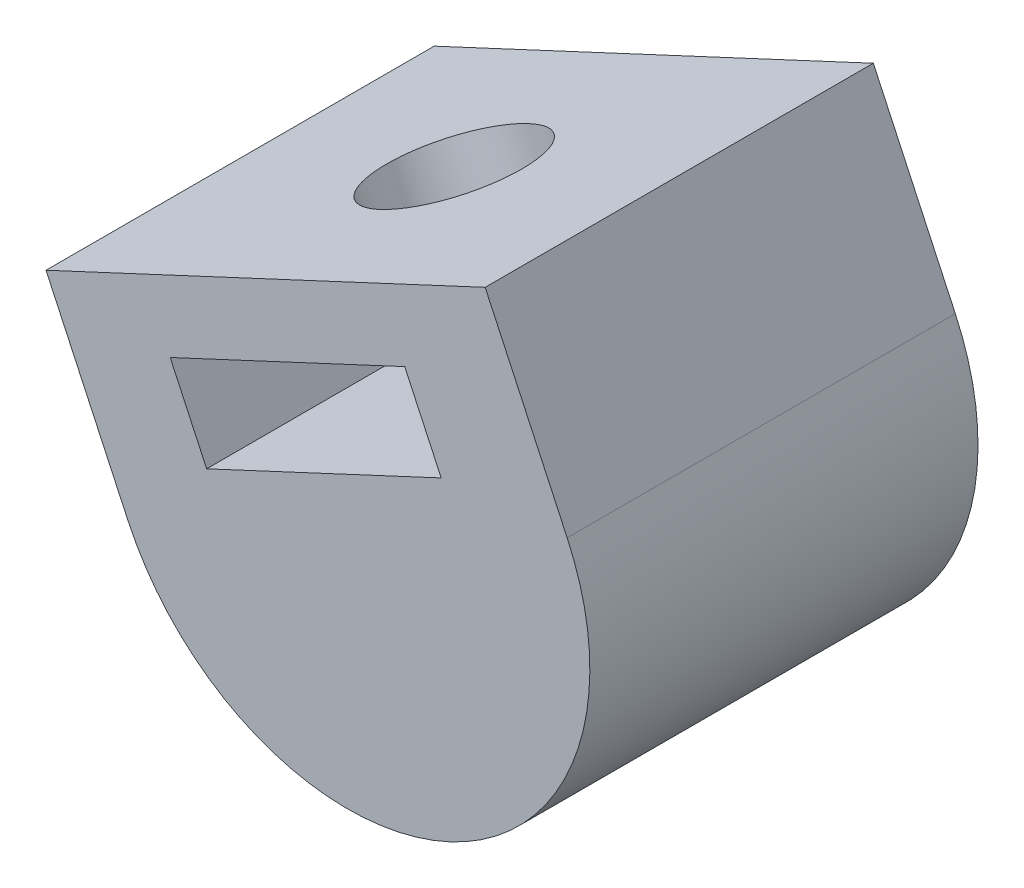
ISO-10303-21;
HEADER;
FILE_DESCRIPTION(('STEP AP214'),'2;1');
FILE_NAME('part.step','',(''),(''),'','','');
FILE_SCHEMA(('AUTOMOTIVE_DESIGN { 1 0 10303 214 1 1 1 1 }'));
ENDSEC;
DATA;
#1=APPLICATION_CONTEXT('core data for automotive mechanical design processes');
#2=APPLICATION_PROTOCOL_DEFINITION('international standard','automotive_design',2000,#1);
#3=PRODUCT_CONTEXT('',#1,'mechanical');
#4=PRODUCT('Part','Part','',(#3));
#5=PRODUCT_RELATED_PRODUCT_CATEGORY('part','',(#4));
#6=PRODUCT_DEFINITION_FORMATION('','',#4);
#7=PRODUCT_DEFINITION_CONTEXT('part definition',#1,'design');
#8=PRODUCT_DEFINITION('design','',#6,#7);
#9=PRODUCT_DEFINITION_SHAPE('','',#8);
#10=(LENGTH_UNIT() NAMED_UNIT(*) SI_UNIT(.MILLI.,.METRE.));
#11=(NAMED_UNIT(*) PLANE_ANGLE_UNIT() SI_UNIT($,.RADIAN.));
#12=(NAMED_UNIT(*) SI_UNIT($,.STERADIAN.) SOLID_ANGLE_UNIT());
#13=UNCERTAINTY_MEASURE_WITH_UNIT(LENGTH_MEASURE(1.E-05),#10,'distance_accuracy_value','');
#14=(GEOMETRIC_REPRESENTATION_CONTEXT(3) GLOBAL_UNCERTAINTY_ASSIGNED_CONTEXT((#13)) GLOBAL_UNIT_ASSIGNED_CONTEXT((#10,
#11,#12)) REPRESENTATION_CONTEXT('',''));
#15=CARTESIAN_POINT('',(0.,0.,0.));
#16=DIRECTION('',(0.,0.,1.));
#17=DIRECTION('',(1.,0.,0.));
#18=AXIS2_PLACEMENT_3D('',#15,#16,#17);
#19=CARTESIAN_POINT('',(-58.4915042211938,328.701917424214,705.274961638451));
#20=DIRECTION('',(-0.4226182617407,0.90630778703665,0.));
#21=DIRECTION('',(0.90630778703665,0.4226182617407,0.));
#22=AXIS2_PLACEMENT_3D('',#19,#20,#21);
#23=CYLINDRICAL_SURFACE('',#22,1.725);
#24=CARTESIAN_POINT('',(-53.208775949435,317.373070086256,705.274961638451));
#25=DIRECTION('',(0.422618261740699,-0.90630778703665,0.));
#26=DIRECTION('',(0.90630778703665,0.422618261740699,0.));
#27=AXIS2_PLACEMENT_3D('',#24,#25,#26);
#28=CIRCLE('',#27,1.725);
#29=CARTESIAN_POINT('',(-51.6453950167968,318.102086587759,705.274961638451));
#30=VERTEX_POINT('',#29);
#31=EDGE_CURVE('E118',#30,#30,#28,.T.);
#32=ORIENTED_EDGE('',*,*,#31,.F.);
#33=EDGE_LOOP('',(#32));
#34=FACE_BOUND('',#33,.T.);
#35=CARTESIAN_POINT('',(-52.574848556824,316.013608405701,705.274961638451));
#36=DIRECTION('',(-0.4226182617407,0.90630778703665,0.));
#37=DIRECTION('',(0.90630778703665,0.4226182617407,0.));
#38=AXIS2_PLACEMENT_3D('',#35,#36,#37);
#39=CIRCLE('',#38,1.725);
#40=CARTESIAN_POINT('',(-51.0114676241858,316.742624907204,705.274961638451));
#41=VERTEX_POINT('',#40);
#42=EDGE_CURVE('E168',#41,#41,#39,.T.);
#43=ORIENTED_EDGE('',*,*,#42,.F.);
#44=EDGE_LOOP('',(#43));
#45=FACE_BOUND('',#44,.T.);
#46=ADVANCED_FACE('F15',(#34,#45),#23,.F.);
#47=CARTESIAN_POINT('',(-58.4915042211938,328.701917424214,705.274961638451));
#48=DIRECTION('',(-0.4226182617407,0.90630778703665,0.));
#49=DIRECTION('',(0.90630778703665,0.4226182617407,0.));
#50=AXIS2_PLACEMENT_3D('',#47,#48,#49);
#51=CYLINDRICAL_SURFACE('',#50,1.725);
#52=CARTESIAN_POINT('',(-51.7296120333426,314.200992831628,705.274961638451));
#53=DIRECTION('',(0.4226182617407,-0.90630778703665,0.));
#54=DIRECTION('',(0.90630778703665,0.4226182617407,0.));
#55=AXIS2_PLACEMENT_3D('',#52,#53,#54);
#56=CIRCLE('',#55,1.725);
#57=CARTESIAN_POINT('',(-50.1662311007044,314.930009333131,705.274961638451));
#58=VERTEX_POINT('',#57);
#59=EDGE_CURVE('E10',#58,#58,#56,.T.);
#60=ORIENTED_EDGE('',*,*,#59,.F.);
#61=EDGE_LOOP('',(#60));
#62=FACE_BOUND('',#61,.T.);
#63=CARTESIAN_POINT('',(-47.4662810061886,309.139947670411,705.274962199146));
#64=CARTESIAN_POINT('',(-47.4662815410024,309.139946568465,705.369832388337));
#65=CARTESIAN_POINT('',(-47.4724130890117,309.134518511518,705.464711682187));
#66=CARTESIAN_POINT('',(-47.4968126855066,309.113200644251,705.651703281042));
#67=CARTESIAN_POINT('',(-47.5150841830552,309.097307860826,705.743814791921));
#68=CARTESIAN_POINT('',(-47.5633716388458,309.056199591341,705.9225511289));
#69=CARTESIAN_POINT('',(-47.5933700093457,309.030998069456,706.009183946835));
#70=CARTESIAN_POINT('',(-47.6646027934089,308.972866248474,706.17490341727));
#71=CARTESIAN_POINT('',(-47.705838866681,308.939934807836,706.253988952773));
#72=CARTESIAN_POINT('',(-47.8001219368036,308.867298409225,706.404607150837));
#73=CARTESIAN_POINT('',(-47.8534451602928,308.827441163681,706.475893562954));
#74=CARTESIAN_POINT('',(-47.9704288036865,308.743739089574,706.606685487549));
#75=CARTESIAN_POINT('',(-48.0340901813065,308.699893891737,706.666189907422));
#76=CARTESIAN_POINT('',(-48.1716773234788,308.60975968082,706.772564850328));
#77=CARTESIAN_POINT('',(-48.2457420178201,308.563443972135,706.819233704374));
#78=CARTESIAN_POINT('',(-48.4018017080488,308.47126597415,706.897245679985));
#79=CARTESIAN_POINT('',(-48.4837948008438,308.425403578938,706.928592468495));
#80=CARTESIAN_POINT('',(-48.6509780584652,308.337597947447,706.974158781225));
#81=CARTESIAN_POINT('',(-48.7359918599348,308.295577493181,706.988876293972));
#82=CARTESIAN_POINT('',(-48.9090938558653,308.215517444955,707.002401286348));
#83=CARTESIAN_POINT('',(-48.9971814911041,308.177477131871,707.001211645067));
#84=CARTESIAN_POINT('',(-49.1712931431152,308.107485546846,706.983292117599));
#85=CARTESIAN_POINT('',(-49.2573061655355,308.075394000211,706.966996735808));
#86=CARTESIAN_POINT('',(-49.427220751448,308.016546423408,706.920094762925));
#87=CARTESIAN_POINT('',(-49.5111221136763,307.98979090015,706.889486813094));
#88=CARTESIAN_POINT('',(-49.6759312162397,307.941224124186,706.81424964698));
#89=CARTESIAN_POINT('',(-49.7567543575809,307.919513985467,706.769370453741));
#90=CARTESIAN_POINT('',(-49.9113977379439,307.881330746246,706.667061727911));
#91=CARTESIAN_POINT('',(-49.9852160583263,307.864859077687,706.60962877096));
#92=CARTESIAN_POINT('',(-50.1266613414979,307.835915441796,706.480921439785));
#93=CARTESIAN_POINT('',(-50.1938855214718,307.823645945534,706.409158032466));
#94=CARTESIAN_POINT('',(-50.3160481711363,307.803236396622,706.255304462243));
#95=CARTESIAN_POINT('',(-50.3709854590363,307.795096741097,706.173213307171));
#96=CARTESIAN_POINT('',(-50.4667220841544,307.781990015005,706.000205741894));
#97=CARTESIAN_POINT('',(-50.5074283405168,307.777043659157,705.909236030408));
#98=CARTESIAN_POINT('',(-50.5722854231581,307.769595676079,705.721486182407));
#99=CARTESIAN_POINT('',(-50.5964432386562,307.767093016565,705.624708517681));
#100=CARTESIAN_POINT('',(-50.6262158673529,307.764062463126,705.432986348161));
#101=CARTESIAN_POINT('',(-50.6326510061677,307.76344705171,705.338170436926));
#102=CARTESIAN_POINT('',(-50.6290076501959,307.763805075535,705.148869498186));
#103=CARTESIAN_POINT('',(-50.6189318595029,307.764778250605,705.054384419039));
#104=CARTESIAN_POINT('',(-50.5833646291182,307.768469881417,704.871493988389));
#105=CARTESIAN_POINT('',(-50.5583648161911,307.771132841358,704.78299091546));
#106=CARTESIAN_POINT('',(-50.4944895576784,307.778622683216,704.611247135083));
#107=CARTESIAN_POINT('',(-50.4556117224934,307.78344993783,704.528007336804));
#108=CARTESIAN_POINT('',(-50.3640390702933,307.796122857899,704.366176052029));
#109=CARTESIAN_POINT('',(-50.310937851797,307.804061143129,704.287822147214));
#110=CARTESIAN_POINT('',(-50.1934616087111,307.823747127438,704.140609602092));
#111=CARTESIAN_POINT('',(-50.129083353779,307.83549591887,704.071753692646));
#112=CARTESIAN_POINT('',(-49.9877786461993,307.864261195231,703.942096092325));
#113=CARTESIAN_POINT('',(-49.9103999531131,307.881502327685,703.881835644409));
#114=CARTESIAN_POINT('',(-49.7479789372193,307.921760043341,703.775135562457));
#115=CARTESIAN_POINT('',(-49.6629366617326,307.944776590884,703.728695843089));
#116=CARTESIAN_POINT('',(-49.4881456598929,307.996898229024,703.651219988901));
#117=CARTESIAN_POINT('',(-49.3984116162441,308.025985088102,703.620138647473));
#118=CARTESIAN_POINT('',(-49.2169423514731,308.09016494702,703.574340522409));
#119=CARTESIAN_POINT('',(-49.1252077845148,308.125256008461,703.559618468791));
#120=CARTESIAN_POINT('',(-48.9466671759879,308.199086146244,703.547428832895));
#121=CARTESIAN_POINT('',(-48.8598181504771,308.237605002372,703.549250199138));
#122=CARTESIAN_POINT('',(-48.6896073278886,308.318280887788,703.568443911326));
#123=CARTESIAN_POINT('',(-48.6062451899058,308.360437560175,703.585814733298));
#124=CARTESIAN_POINT('',(-48.4467214660518,308.445988285816,703.635071159205));
#125=CARTESIAN_POINT('',(-48.3704563624884,308.489345801154,703.666686547334));
#126=CARTESIAN_POINT('',(-48.2251372871655,308.576238693135,703.743369210743));
#127=CARTESIAN_POINT('',(-48.1560843415494,308.619774094176,703.788438396714));
#128=CARTESIAN_POINT('',(-48.0246596236783,308.706316581774,703.892212502126));
#129=CARTESIAN_POINT('',(-47.9625299910687,308.749274482256,703.951264865894));
#130=CARTESIAN_POINT('',(-47.8482774353496,308.831269245151,704.080708975486));
#131=CARTESIAN_POINT('',(-47.796157281688,308.870305020959,704.151103849706));
#132=CARTESIAN_POINT('',(-47.7012360625873,308.94353343109,704.30388656805));
#133=CARTESIAN_POINT('',(-47.6587836413034,308.977532816031,704.386584359186));
#134=CARTESIAN_POINT('',(-47.5861018894124,309.037028548994,704.56000680196));
#135=CARTESIAN_POINT('',(-47.5558679590629,309.062528096209,704.650728417262));
#136=CARTESIAN_POINT('',(-47.5102347619426,309.101511441701,704.829560444934));
#137=CARTESIAN_POINT('',(-47.4937780240755,309.115844196652,704.917217255977));
#138=CARTESIAN_POINT('',(-47.471801941202,309.135061927956,705.094901016265));
#139=CARTESIAN_POINT('',(-47.4662804986341,309.13994871619,705.18492750761));
#140=CARTESIAN_POINT('',(-47.4662810061886,309.139947670411,705.274962199146));
#141=B_SPLINE_CURVE_WITH_KNOTS('',3,(#63,#64,#65,#66,#67,#68,#69,#70,#71,#72,#73,#74,#75,#76,
#77,#78,#79,#80,#81,#82,#83,#84,#85,#86,#87,#88,#89,#90,#91,#92,#93,#94,#95,#96,#97,#98,#99,
#100,#101,#102,#103,#104,#105,#106,#107,#108,#109,#110,#111,#112,#113,#114,#115,#116,#117,#118,
#119,#120,#121,#122,#123,#124,#125,#126,#127,#128,#129,#130,#131,#132,#133,#134,#135,#136,#137,
#138,#139,#140),.UNSPECIFIED.,.T.,.F.,(4,2,2,2,2,2,2,2,2,2,2,2,2,2,2,2,2,2,2,2,2,2,2,2,2,2,2,2,
2,2,2,2,2,2,2,2,2,2,4),(0.,0.284280031897781,0.568640864727391,0.85257684475264,
1.13655478234896,1.42782866502052,1.71912954639972,2.01477512440425,2.31034991248505,
2.59681699788449,2.88323223534569,3.16165638613407,3.44010697398648,3.72373178304281,
4.00743405481161,4.30333698041896,4.59926835464024,4.89710062296492,5.19480702441089,
5.47848153208782,5.76210958533864,6.03687341178668,6.31168457152043,6.59538851426581,
6.87917385819079,7.17650332232316,7.47383095063508,7.77027811803814,8.06662976023287,
8.35030628717471,8.6339550145791,8.91243585102633,9.19095625581117,9.47729975520451,
9.76372236706075,10.0592439480939,10.3546541739507,10.6244963251381,10.8942867113473),.UNSPECIFIED.);
#142=CARTESIAN_POINT('',(-47.4662810061886,309.139947670411,705.274962199146));
#143=VERTEX_POINT('',#142);
#144=EDGE_CURVE('E19',#143,#143,#141,.F.);
#145=ORIENTED_EDGE('',*,*,#144,.F.);
#146=EDGE_LOOP('',(#145));
#147=FACE_BOUND('',#146,.T.);
#148=ADVANCED_FACE('F191',(#62,#147),#51,.F.);
#149=CARTESIAN_POINT('',(-51.7296120333426,314.200992831628,703.274961638451));
#150=DIRECTION('',(0.4226182617407,-0.90630778703665,0.));
#151=DIRECTION('',(0.90630778703665,0.4226182617407,0.));
#152=AXIS2_PLACEMENT_3D('',#149,#150,#151);
#153=PLANE('',#152);
#154=ORIENTED_EDGE('',*,*,#59,.T.);
#155=EDGE_LOOP('',(#154));
#156=FACE_BOUND('',#155,.T.);
#157=DIRECTION('',(0.90630778703665,0.4226182617407,0.));
#158=VECTOR('',#157,1.);
#159=CARTESIAN_POINT('',(-51.4488500361707,314.331914301028,700.774898862839));
#160=LINE('',#159,#158);
#161=CARTESIAN_POINT('',(-54.4485353944526,312.933138046406,700.774898862839));
#162=VERTEX_POINT('',#161);
#163=CARTESIAN_POINT('',(-49.0106886722327,315.46884761685,700.774898862839));
#164=VERTEX_POINT('',#163);
#165=EDGE_CURVE('E38',#162,#164,#160,.T.);
#166=ORIENTED_EDGE('',*,*,#165,.F.);
#167=DIRECTION('',(0.,0.,-1.));
#168=VECTOR('',#167,1.);
#169=CARTESIAN_POINT('',(-54.4485353944526,312.933138046406,703.274961638451));
#170=LINE('',#169,#168);
#171=CARTESIAN_POINT('',(-54.4485353944526,312.933138046406,709.774948120117));
#172=VERTEX_POINT('',#171);
#173=EDGE_CURVE('E156',#172,#162,#170,.T.);
#174=ORIENTED_EDGE('',*,*,#173,.F.);
#175=DIRECTION('',(-0.90630778703665,-0.4226182617407,0.));
#176=VECTOR('',#175,1.);
#177=CARTESIAN_POINT('',(-51.4488500361707,314.331914301028,709.774948120117));
#178=LINE('',#177,#176);
#179=CARTESIAN_POINT('',(-49.0106886722327,315.46884761685,709.774948120117));
#180=VERTEX_POINT('',#179);
#181=EDGE_CURVE('E161',#180,#172,#178,.T.);
#182=ORIENTED_EDGE('',*,*,#181,.F.);
#183=DIRECTION('',(0.,0.,1.));
#184=VECTOR('',#183,1.);
#185=CARTESIAN_POINT('',(-49.0106886722327,315.46884761685,703.274961638451));
#186=LINE('',#185,#184);
#187=EDGE_CURVE('E29',#164,#180,#186,.T.);
#188=ORIENTED_EDGE('',*,*,#187,.F.);
#189=EDGE_LOOP('',(#166,#174,#182,#188));
#190=FACE_BOUND('',#189,.T.);
#191=ADVANCED_FACE('F198',(#156,#190),#153,.F.);
#192=CARTESIAN_POINT('',(-50.2785434574548,318.18777097796,703.274961638451));
#193=DIRECTION('',(-0.90630778703665,-0.4226182617407,0.));
#194=DIRECTION('',(0.4226182617407,-0.90630778703665,0.));
#195=AXIS2_PLACEMENT_3D('',#192,#193,#194);
#196=PLANE('',#195);
#197=DIRECTION('',(-0.4226182617407,0.90630778703665,0.));
#198=VECTOR('',#197,1.);
#199=CARTESIAN_POINT('',(-50.4898525883252,318.640924871478,700.774898862839));
#200=LINE('',#199,#198);
#201=CARTESIAN_POINT('',(-49.8559251957142,317.281463190923,700.774898862839));
#202=VERTEX_POINT('',#201);
#203=EDGE_CURVE('E152',#164,#202,#200,.T.);
#204=ORIENTED_EDGE('',*,*,#203,.F.);
#205=ORIENTED_EDGE('',*,*,#187,.T.);
#206=DIRECTION('',(0.4226182617407,-0.90630778703665,0.));
#207=VECTOR('',#206,1.);
#208=CARTESIAN_POINT('',(-50.4898525883252,318.640924871478,709.774948120117));
#209=LINE('',#208,#207);
#210=CARTESIAN_POINT('',(-49.8559251957142,317.281463190923,709.774948120117));
#211=VERTEX_POINT('',#210);
#212=EDGE_CURVE('E171',#211,#180,#209,.T.);
#213=ORIENTED_EDGE('',*,*,#212,.F.);
#214=DIRECTION('',(0.,0.,-1.));
#215=VECTOR('',#214,1.);
#216=CARTESIAN_POINT('',(-49.8559251957142,317.281463190923,703.274961638451));
#217=LINE('',#216,#215);
#218=EDGE_CURVE('E173',#211,#202,#217,.T.);
#219=ORIENTED_EDGE('',*,*,#218,.T.);
#220=EDGE_LOOP('',(#204,#205,#213,#219));
#221=FACE_BOUND('',#220,.T.);
#222=ADVANCED_FACE('F205',(#221),#196,.T.);
#223=CARTESIAN_POINT('',(-52.574848556824,316.013608405701,703.274961638451));
#224=DIRECTION('',(0.4226182617407,-0.90630778703665,0.));
#225=DIRECTION('',(0.90630778703665,0.4226182617407,0.));
#226=AXIS2_PLACEMENT_3D('',#223,#224,#225);
#227=PLANE('',#226);
#228=ORIENTED_EDGE('',*,*,#42,.T.);
#229=EDGE_LOOP('',(#228));
#230=FACE_BOUND('',#229,.T.);
#231=DIRECTION('',(-0.90630778703665,-0.4226182617407,0.));
#232=VECTOR('',#231,1.);
#233=CARTESIAN_POINT('',(-52.2940865596521,316.144529875101,700.774898862839));
#234=LINE('',#233,#232);
#235=CARTESIAN_POINT('',(-55.293771917934,314.745753620479,700.774898862839));
#236=VERTEX_POINT('',#235);
#237=EDGE_CURVE('E150',#202,#236,#234,.T.);
#238=ORIENTED_EDGE('',*,*,#237,.F.);
#239=ORIENTED_EDGE('',*,*,#218,.F.);
#240=DIRECTION('',(0.90630778703665,0.4226182617407,0.));
#241=VECTOR('',#240,1.);
#242=CARTESIAN_POINT('',(-52.2940865596521,316.144529875101,709.774948120117));
#243=LINE('',#242,#241);
#244=CARTESIAN_POINT('',(-55.293771917934,314.745753620479,709.774948120117));
#245=VERTEX_POINT('',#244);
#246=EDGE_CURVE('E135',#245,#211,#243,.T.);
#247=ORIENTED_EDGE('',*,*,#246,.F.);
#248=DIRECTION('',(0.,0.,1.));
#249=VECTOR('',#248,1.);
#250=CARTESIAN_POINT('',(-55.293771917934,314.745753620479,703.274961638451));
#251=LINE('',#250,#249);
#252=EDGE_CURVE('E165',#236,#245,#251,.T.);
#253=ORIENTED_EDGE('',*,*,#252,.F.);
#254=EDGE_LOOP('',(#238,#239,#247,#253));
#255=FACE_BOUND('',#254,.T.);
#256=ADVANCED_FACE('F187',(#230,#255),#227,.T.);
#257=CARTESIAN_POINT('',(-55.7163901796747,315.652061407516,703.274961638451));
#258=DIRECTION('',(0.90630778703665,0.4226182617407,0.));
#259=DIRECTION('',(-0.4226182617407,0.90630778703665,0.));
#260=AXIS2_PLACEMENT_3D('',#257,#258,#259);
#261=PLANE('',#260);
#262=DIRECTION('',(0.4226182617407,-0.90630778703665,0.));
#263=VECTOR('',#262,1.);
#264=CARTESIAN_POINT('',(-55.927699310545,316.105215301034,700.774898862839));
#265=LINE('',#264,#263);
#266=EDGE_CURVE('E162',#236,#162,#265,.T.);
#267=ORIENTED_EDGE('',*,*,#266,.F.);
#268=ORIENTED_EDGE('',*,*,#252,.T.);
#269=DIRECTION('',(-0.4226182617407,0.90630778703665,0.));
#270=VECTOR('',#269,1.);
#271=CARTESIAN_POINT('',(-55.927699310545,316.105215301034,709.774948120117));
#272=LINE('',#271,#270);
#273=EDGE_CURVE('E158',#172,#245,#272,.T.);
#274=ORIENTED_EDGE('',*,*,#273,.F.);
#275=ORIENTED_EDGE('',*,*,#173,.T.);
#276=EDGE_LOOP('',(#267,#268,#274,#275));
#277=FACE_BOUND('',#276,.T.);
#278=ADVANCED_FACE('F212',(#277),#261,.T.);
#279=CARTESIAN_POINT('',(-52.8865954103063,312.558079524206,710.024948120117));
#280=DIRECTION('',(0.4226182617407,-0.90630778703665,0.));
#281=DIRECTION('',(0.90630778703665,0.4226182617407,0.));
#282=AXIS2_PLACEMENT_3D('',#279,#280,#281);
#283=PLANE('',#282);
#284=DIRECTION('',(0.90630778703665,0.4226182617407,0.));
#285=VECTOR('',#284,1.);
#286=CARTESIAN_POINT('',(-51.8160277716429,313.057293412687,709.774948120117));
#287=LINE('',#286,#285);
#288=CARTESIAN_POINT('',(-46.0897401614356,315.727505178125,709.774948120117));
#289=VERTEX_POINT('',#288);
#290=CARTESIAN_POINT('',(-46.0892870075315,315.727716487261,709.774948120117));
#291=VERTEX_POINT('',#290);
#292=EDGE_CURVE('E131',#289,#291,#287,.T.);
#293=ORIENTED_EDGE('',*,*,#292,.F.);
#294=DIRECTION('',(0.,0.,-1.));
#295=VECTOR('',#294,1.);
#296=CARTESIAN_POINT('',(-46.0897401614356,315.727505178125,720.024948120117));
#297=LINE('',#296,#295);
#298=CARTESIAN_POINT('',(-46.0897401614356,315.727505178125,700.774898862839));
#299=VERTEX_POINT('',#298);
#300=EDGE_CURVE('E153',#289,#299,#297,.T.);
#301=ORIENTED_EDGE('',*,*,#300,.T.);
#302=DIRECTION('',(-0.90630778703665,-0.4226182617407,0.));
#303=VECTOR('',#302,1.);
#304=CARTESIAN_POINT('',(-51.8160277716429,313.057293412687,700.774898862839));
#305=LINE('',#304,#303);
#306=CARTESIAN_POINT('',(-46.0892870075315,315.727716487261,700.774898862839));
#307=VERTEX_POINT('',#306);
#308=EDGE_CURVE('E141',#307,#299,#305,.T.);
#309=ORIENTED_EDGE('',*,*,#308,.F.);
#310=DIRECTION('',(0.,0.,-1.));
#311=VECTOR('',#310,1.);
#312=CARTESIAN_POINT('',(-46.0892870075315,315.727716487261,711.649955749512));
#313=LINE('',#312,#311);
#314=EDGE_CURVE('E145',#291,#307,#313,.T.);
#315=ORIENTED_EDGE('',*,*,#314,.F.);
#316=EDGE_LOOP('',(#293,#301,#309,#315));
#317=FACE_BOUND('',#316,.T.);
#318=ADVANCED_FACE('F215',(#317),#283,.T.);
#319=CARTESIAN_POINT('',(-51.1804758461804,313.353668792006,720.024948120117));
#320=DIRECTION('',(0.,0.,1.));
#321=DIRECTION('',(0.90630778703665,0.422618261740699,0.));
#322=AXIS2_PLACEMENT_3D('',#319,#320,#321);
#323=CYLINDRICAL_SURFACE('',#322,5.617);
#324=ORIENTED_EDGE('',*,*,#144,.T.);
#325=EDGE_LOOP('',(#324));
#326=FACE_BOUND('',#325,.T.);
#327=CARTESIAN_POINT('',(-51.1804758461804,313.353668792006,709.774948120117));
#328=DIRECTION('',(0.,0.,1.));
#329=DIRECTION('',(0.90630778703665,0.422618261740699,0.));
#330=AXIS2_PLACEMENT_3D('',#327,#328,#329);
#331=CIRCLE('',#330,5.617);
#332=CARTESIAN_POINT('',(-56.2712018409841,310.97981162574,709.774948120117));
#333=VERTEX_POINT('',#332);
#334=EDGE_CURVE('E119',#333,#289,#331,.T.);
#335=ORIENTED_EDGE('',*,*,#334,.F.);
#336=DIRECTION('',(0.,0.,1.));
#337=VECTOR('',#336,1.);
#338=CARTESIAN_POINT('',(-56.2712018409841,310.97981162574,720.024948120117));
#339=LINE('',#338,#337);
#340=CARTESIAN_POINT('',(-56.2712018409841,310.97981162574,700.774898862839));
#341=VERTEX_POINT('',#340);
#342=EDGE_CURVE('E142',#341,#333,#339,.T.);
#343=ORIENTED_EDGE('',*,*,#342,.F.);
#344=CARTESIAN_POINT('',(-51.1804758461804,313.353668792006,700.774898862839));
#345=DIRECTION('',(0.,0.,-1.));
#346=DIRECTION('',(0.90630778703665,0.422618261740699,0.));
#347=AXIS2_PLACEMENT_3D('',#344,#345,#346);
#348=CIRCLE('',#347,5.617);
#349=EDGE_CURVE('E137',#299,#341,#348,.T.);
#350=ORIENTED_EDGE('',*,*,#349,.F.);
#351=ORIENTED_EDGE('',*,*,#300,.F.);
#352=EDGE_LOOP('',(#335,#343,#350,#351));
#353=FACE_BOUND('',#352,.T.);
#354=ADVANCED_FACE('F218',(#326,#353),#323,.T.);
#355=CARTESIAN_POINT('',(-52.8865954103063,312.558079524206,710.024948120117));
#356=DIRECTION('',(0.4226182617407,-0.90630778703665,0.));
#357=DIRECTION('',(0.90630778703665,0.4226182617407,0.));
#358=AXIS2_PLACEMENT_3D('',#355,#356,#357);
#359=PLANE('',#358);
#360=DIRECTION('',(0.90630778703665,0.4226182617407,0.));
#361=VECTOR('',#360,1.);
#362=CARTESIAN_POINT('',(-51.8160277716429,313.057293412687,709.774948120117));
#363=LINE('',#362,#361);
#364=CARTESIAN_POINT('',(-56.2717955858789,310.979534757949,709.774948120117));
#365=VERTEX_POINT('',#364);
#366=EDGE_CURVE('E110',#365,#333,#363,.T.);
#367=ORIENTED_EDGE('',*,*,#366,.F.);
#368=DIRECTION('',(0.,0.,1.));
#369=VECTOR('',#368,1.);
#370=CARTESIAN_POINT('',(-56.2717955858789,310.979534757949,711.649955749512));
#371=LINE('',#370,#369);
#372=CARTESIAN_POINT('',(-56.2717955858789,310.979534757949,700.774898862839));
#373=VERTEX_POINT('',#372);
#374=EDGE_CURVE('E105',#373,#365,#371,.T.);
#375=ORIENTED_EDGE('',*,*,#374,.F.);
#376=DIRECTION('',(-0.90630778703665,-0.4226182617407,0.));
#377=VECTOR('',#376,1.);
#378=CARTESIAN_POINT('',(-51.8160277716429,313.057293412687,700.774898862839));
#379=LINE('',#378,#377);
#380=EDGE_CURVE('E129',#341,#373,#379,.T.);
#381=ORIENTED_EDGE('',*,*,#380,.F.);
#382=ORIENTED_EDGE('',*,*,#342,.T.);
#383=EDGE_LOOP('',(#367,#375,#381,#382));
#384=FACE_BOUND('',#383,.T.);
#385=ADVANCED_FACE('F223',(#384),#359,.T.);
#386=CARTESIAN_POINT('',(-48.2023879605136,320.259276104667,713.274963378906));
#387=DIRECTION('',(-0.90630778703665,-0.422618261740699,0.));
#388=DIRECTION('',(0.,0.,1.));
#389=AXIS2_PLACEMENT_3D('',#386,#387,#388);
#390=PLANE('',#389);
#391=ORIENTED_EDGE('',*,*,#314,.T.);
#392=DIRECTION('',(0.422618261740699,-0.90630778703665,0.));
#393=VECTOR('',#392,1.);
#394=CARTESIAN_POINT('',(-48.2023879605136,320.259276104667,700.774898862839));
#395=LINE('',#394,#393);
#396=CARTESIAN_POINT('',(-47.9910788296433,319.806122211148,700.774898862839));
#397=VERTEX_POINT('',#396);
#398=EDGE_CURVE('E127',#397,#307,#395,.T.);
#399=ORIENTED_EDGE('',*,*,#398,.F.);
#400=DIRECTION('',(0.,0.,-1.));
#401=VECTOR('',#400,1.);
#402=CARTESIAN_POINT('',(-47.9910788296433,319.806122211148,713.274963378906));
#403=LINE('',#402,#401);
#404=CARTESIAN_POINT('',(-47.9910788296433,319.806122211148,709.774948120117));
#405=VERTEX_POINT('',#404);
#406=EDGE_CURVE('E122',#405,#397,#403,.T.);
#407=ORIENTED_EDGE('',*,*,#406,.F.);
#408=DIRECTION('',(-0.422618261740699,0.90630778703665,0.));
#409=VECTOR('',#408,1.);
#410=CARTESIAN_POINT('',(-48.2023879605136,320.259276104667,709.774948120117));
#411=LINE('',#410,#409);
#412=EDGE_CURVE('E116',#291,#405,#411,.T.);
#413=ORIENTED_EDGE('',*,*,#412,.F.);
#414=EDGE_LOOP('',(#391,#399,#407,#413));
#415=FACE_BOUND('',#414,.T.);
#416=ADVANCED_FACE('F227',(#415),#390,.F.);
#417=CARTESIAN_POINT('',(-52.8585610859616,318.088066918575,700.774898862839));
#418=DIRECTION('',(0.,0.,1.));
#419=DIRECTION('',(0.906307787036649,0.422618261740702,0.));
#420=AXIS2_PLACEMENT_3D('',#417,#418,#419);
#421=PLANE('',#420);
#422=ORIENTED_EDGE('',*,*,#237,.T.);
#423=ORIENTED_EDGE('',*,*,#266,.T.);
#424=ORIENTED_EDGE('',*,*,#165,.T.);
#425=ORIENTED_EDGE('',*,*,#203,.T.);
#426=EDGE_LOOP('',(#422,#423,#424,#425));
#427=FACE_BOUND('',#426,.T.);
#428=ORIENTED_EDGE('',*,*,#308,.T.);
#429=ORIENTED_EDGE('',*,*,#349,.T.);
#430=ORIENTED_EDGE('',*,*,#380,.T.);
#431=DIRECTION('',(-0.4226182617407,0.90630778703665,0.));
#432=VECTOR('',#431,1.);
#433=CARTESIAN_POINT('',(-58.3848965388611,315.511094375354,700.774898862839));
#434=LINE('',#433,#432);
#435=CARTESIAN_POINT('',(-58.1735874079908,315.057940481836,700.774898862839));
#436=VERTEX_POINT('',#435);
#437=EDGE_CURVE('E126',#373,#436,#434,.T.);
#438=ORIENTED_EDGE('',*,*,#437,.T.);
#439=DIRECTION('',(0.90630778703665,0.422618261740699,0.));
#440=VECTOR('',#439,1.);
#441=CARTESIAN_POINT('',(-52.6472519550913,317.634913025056,700.774898862839));
#442=LINE('',#441,#440);
#443=EDGE_CURVE('E94',#436,#397,#442,.T.);
#444=ORIENTED_EDGE('',*,*,#443,.T.);
#445=ORIENTED_EDGE('',*,*,#398,.T.);
#446=EDGE_LOOP('',(#428,#429,#430,#438,#444,#445));
#447=FACE_BOUND('',#446,.T.);
#448=ADVANCED_FACE('F231',(#427,#447),#421,.F.);
#449=CARTESIAN_POINT('',(-52.8585610859616,318.088066918575,709.774948120117));
#450=DIRECTION('',(0.,0.,1.));
#451=DIRECTION('',(0.906307787036649,0.422618261740702,0.));
#452=AXIS2_PLACEMENT_3D('',#449,#450,#451);
#453=PLANE('',#452);
#454=ORIENTED_EDGE('',*,*,#246,.T.);
#455=ORIENTED_EDGE('',*,*,#212,.T.);
#456=ORIENTED_EDGE('',*,*,#181,.T.);
#457=ORIENTED_EDGE('',*,*,#273,.T.);
#458=EDGE_LOOP('',(#454,#455,#456,#457));
#459=FACE_BOUND('',#458,.T.);
#460=ORIENTED_EDGE('',*,*,#292,.T.);
#461=ORIENTED_EDGE('',*,*,#412,.T.);
#462=DIRECTION('',(-0.90630778703665,-0.422618261740699,0.));
#463=VECTOR('',#462,1.);
#464=CARTESIAN_POINT('',(-52.6472519550913,317.634913025056,709.774948120117));
#465=LINE('',#464,#463);
#466=CARTESIAN_POINT('',(-58.1735874079908,315.057940481836,709.774948120117));
#467=VERTEX_POINT('',#466);
#468=EDGE_CURVE('E109',#405,#467,#465,.T.);
#469=ORIENTED_EDGE('',*,*,#468,.T.);
#470=DIRECTION('',(0.4226182617407,-0.90630778703665,0.));
#471=VECTOR('',#470,1.);
#472=CARTESIAN_POINT('',(-58.3848965388611,315.511094375354,709.774948120117));
#473=LINE('',#472,#471);
#474=EDGE_CURVE('E100',#467,#365,#473,.T.);
#475=ORIENTED_EDGE('',*,*,#474,.T.);
#476=ORIENTED_EDGE('',*,*,#366,.T.);
#477=ORIENTED_EDGE('',*,*,#334,.T.);
#478=EDGE_LOOP('',(#460,#461,#469,#475,#476,#477));
#479=FACE_BOUND('',#478,.T.);
#480=ADVANCED_FACE('F114',(#459,#479),#453,.T.);
#481=CARTESIAN_POINT('',(-58.3848965388611,315.511094375354,713.274963378906));
#482=DIRECTION('',(0.90630778703665,0.422618261740699,0.));
#483=DIRECTION('',(0.,0.,-1.));
#484=AXIS2_PLACEMENT_3D('',#481,#482,#483);
#485=PLANE('',#484);
#486=ORIENTED_EDGE('',*,*,#374,.T.);
#487=ORIENTED_EDGE('',*,*,#474,.F.);
#488=DIRECTION('',(0.,0.,-1.));
#489=VECTOR('',#488,1.);
#490=CARTESIAN_POINT('',(-58.1735874079908,315.057940481836,713.274963378906));
#491=LINE('',#490,#489);
#492=EDGE_CURVE('E104',#467,#436,#491,.T.);
#493=ORIENTED_EDGE('',*,*,#492,.T.);
#494=ORIENTED_EDGE('',*,*,#437,.F.);
#495=EDGE_LOOP('',(#486,#487,#493,#494));
#496=FACE_BOUND('',#495,.T.);
#497=ADVANCED_FACE('F102',(#496),#485,.F.);
#498=CARTESIAN_POINT('',(-52.6472519550913,317.634913025056,713.274963378906));
#499=DIRECTION('',(0.422618261740699,-0.90630778703665,0.));
#500=DIRECTION('',(0.,0.,-1.));
#501=AXIS2_PLACEMENT_3D('',#498,#499,#500);
#502=PLANE('',#501);
#503=ORIENTED_EDGE('',*,*,#31,.T.);
#504=EDGE_LOOP('',(#503));
#505=FACE_BOUND('',#504,.T.);
#506=ORIENTED_EDGE('',*,*,#406,.T.);
#507=ORIENTED_EDGE('',*,*,#443,.F.);
#508=ORIENTED_EDGE('',*,*,#492,.F.);
#509=ORIENTED_EDGE('',*,*,#468,.F.);
#510=EDGE_LOOP('',(#506,#507,#508,#509));
#511=FACE_BOUND('',#510,.T.);
#512=ADVANCED_FACE('F17',(#505,#511),#502,.F.);
#513=CLOSED_SHELL('',(#46,#148,#191,#222,#256,#278,#318,#354,#385,#416,#448,#480,#497,#512));
#514=MANIFOLD_SOLID_BREP('B1',#513);
#515=ADVANCED_BREP_SHAPE_REPRESENTATION('',(#18,#514),#14);
#516=SHAPE_DEFINITION_REPRESENTATION(#9,#515);
ENDSEC;
END-ISO-10303-21;
